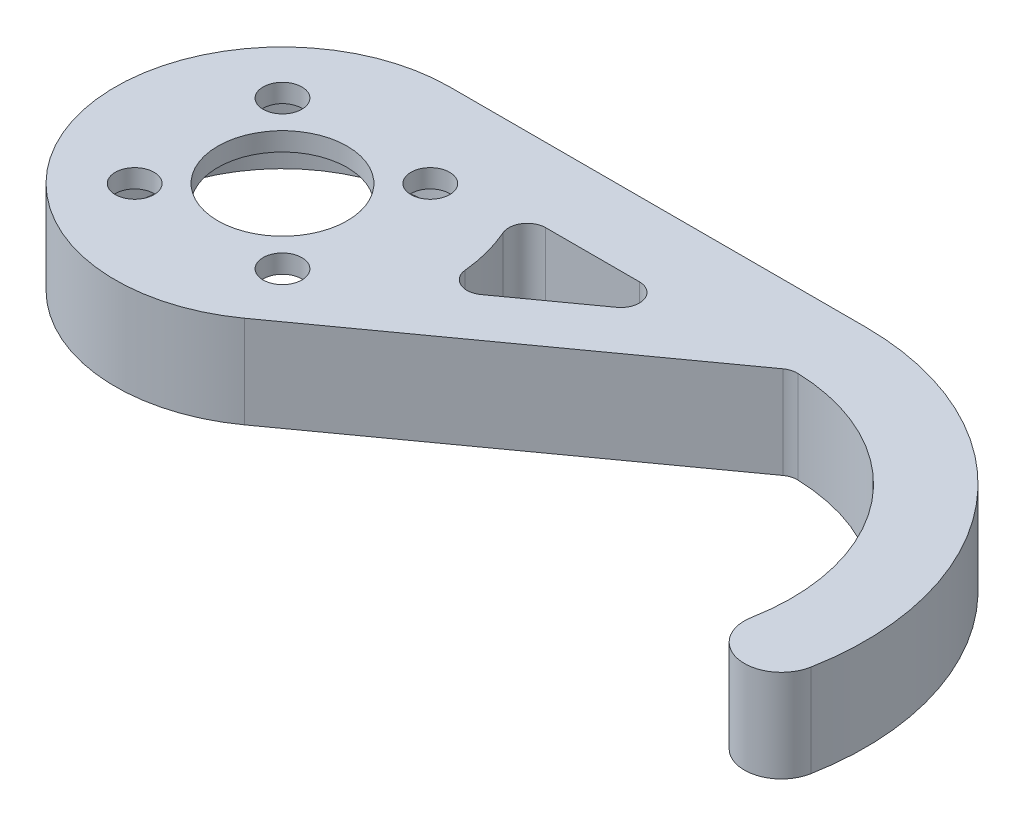
ISO-10303-21;
HEADER;
FILE_DESCRIPTION(('STEP AP214'),'2;1');
FILE_NAME('part.step','',(''),(''),'','','');
FILE_SCHEMA(('AUTOMOTIVE_DESIGN { 1 0 10303 214 1 1 1 1 }'));
ENDSEC;
DATA;
#1=APPLICATION_CONTEXT('core data for automotive mechanical design processes');
#2=APPLICATION_PROTOCOL_DEFINITION('international standard','automotive_design',2000,#1);
#3=PRODUCT_CONTEXT('',#1,'mechanical');
#4=PRODUCT('Part','Part','',(#3));
#5=PRODUCT_RELATED_PRODUCT_CATEGORY('part','',(#4));
#6=PRODUCT_DEFINITION_FORMATION('','',#4);
#7=PRODUCT_DEFINITION_CONTEXT('part definition',#1,'design');
#8=PRODUCT_DEFINITION('design','',#6,#7);
#9=PRODUCT_DEFINITION_SHAPE('','',#8);
#10=(LENGTH_UNIT() NAMED_UNIT(*) SI_UNIT(.MILLI.,.METRE.));
#11=(NAMED_UNIT(*) PLANE_ANGLE_UNIT() SI_UNIT($,.RADIAN.));
#12=(NAMED_UNIT(*) SI_UNIT($,.STERADIAN.) SOLID_ANGLE_UNIT());
#13=UNCERTAINTY_MEASURE_WITH_UNIT(LENGTH_MEASURE(1.E-05),#10,'distance_accuracy_value','');
#14=(GEOMETRIC_REPRESENTATION_CONTEXT(3) GLOBAL_UNCERTAINTY_ASSIGNED_CONTEXT((#13)) GLOBAL_UNIT_ASSIGNED_CONTEXT((#10,
#11,#12)) REPRESENTATION_CONTEXT('',''));
#15=CARTESIAN_POINT('',(0.,0.,0.));
#16=DIRECTION('',(0.,0.,1.));
#17=DIRECTION('',(1.,0.,0.));
#18=AXIS2_PLACEMENT_3D('',#15,#16,#17);
#19=CARTESIAN_POINT('',(-8.,10.,-8.));
#20=DIRECTION('',(0.,-1.,0.));
#21=DIRECTION('',(0.,0.,-1.));
#22=AXIS2_PLACEMENT_3D('',#19,#20,#21);
#23=CYLINDRICAL_SURFACE('',#22,2.1);
#24=CARTESIAN_POINT('',(-8.,10.,-8.));
#25=DIRECTION('',(0.,1.,0.));
#26=DIRECTION('',(0.,0.,1.));
#27=AXIS2_PLACEMENT_3D('',#24,#25,#26);
#28=CIRCLE('',#27,2.1);
#29=CARTESIAN_POINT('',(-8.,10.,-5.9));
#30=VERTEX_POINT('',#29);
#31=EDGE_CURVE('E248',#30,#30,#28,.T.);
#32=ORIENTED_EDGE('',*,*,#31,.T.);
#33=EDGE_LOOP('',(#32));
#34=FACE_BOUND('',#33,.T.);
#35=CARTESIAN_POINT('',(-8.,8.,-8.));
#36=DIRECTION('',(0.,-1.,0.));
#37=DIRECTION('',(0.,0.,-1.));
#38=AXIS2_PLACEMENT_3D('',#35,#36,#37);
#39=CIRCLE('',#38,2.1);
#40=CARTESIAN_POINT('',(-8.,8.,-10.1));
#41=VERTEX_POINT('',#40);
#42=EDGE_CURVE('E369',#41,#41,#39,.T.);
#43=ORIENTED_EDGE('',*,*,#42,.T.);
#44=EDGE_LOOP('',(#43));
#45=FACE_BOUND('',#44,.T.);
#46=ADVANCED_FACE('F41',(#34,#45),#23,.F.);
#47=CARTESIAN_POINT('',(8.,10.,-8.));
#48=DIRECTION('',(0.,-1.,0.));
#49=DIRECTION('',(0.,0.,-1.));
#50=AXIS2_PLACEMENT_3D('',#47,#48,#49);
#51=CYLINDRICAL_SURFACE('',#50,2.1);
#52=CARTESIAN_POINT('',(8.,10.,-8.));
#53=DIRECTION('',(0.,1.,0.));
#54=DIRECTION('',(0.,0.,1.));
#55=AXIS2_PLACEMENT_3D('',#52,#53,#54);
#56=CIRCLE('',#55,2.1);
#57=CARTESIAN_POINT('',(8.,10.,-5.9));
#58=VERTEX_POINT('',#57);
#59=EDGE_CURVE('E255',#58,#58,#56,.T.);
#60=ORIENTED_EDGE('',*,*,#59,.T.);
#61=EDGE_LOOP('',(#60));
#62=FACE_BOUND('',#61,.T.);
#63=CARTESIAN_POINT('',(8.,8.,-8.));
#64=DIRECTION('',(0.,-1.,0.));
#65=DIRECTION('',(0.,0.,-1.));
#66=AXIS2_PLACEMENT_3D('',#63,#64,#65);
#67=CIRCLE('',#66,2.1);
#68=CARTESIAN_POINT('',(8.,8.,-10.1));
#69=VERTEX_POINT('',#68);
#70=EDGE_CURVE('E365',#69,#69,#67,.T.);
#71=ORIENTED_EDGE('',*,*,#70,.T.);
#72=EDGE_LOOP('',(#71));
#73=FACE_BOUND('',#72,.T.);
#74=ADVANCED_FACE('F319',(#62,#73),#51,.F.);
#75=CARTESIAN_POINT('',(8.,10.,8.));
#76=DIRECTION('',(0.,-1.,0.));
#77=DIRECTION('',(0.,0.,-1.));
#78=AXIS2_PLACEMENT_3D('',#75,#76,#77);
#79=CYLINDRICAL_SURFACE('',#78,2.1);
#80=CARTESIAN_POINT('',(8.,10.,8.));
#81=DIRECTION('',(0.,1.,0.));
#82=DIRECTION('',(0.,0.,1.));
#83=AXIS2_PLACEMENT_3D('',#80,#81,#82);
#84=CIRCLE('',#83,2.1);
#85=CARTESIAN_POINT('',(8.,10.,10.1));
#86=VERTEX_POINT('',#85);
#87=EDGE_CURVE('E381',#86,#86,#84,.T.);
#88=ORIENTED_EDGE('',*,*,#87,.T.);
#89=EDGE_LOOP('',(#88));
#90=FACE_BOUND('',#89,.T.);
#91=CARTESIAN_POINT('',(8.,8.,8.));
#92=DIRECTION('',(0.,-1.,0.));
#93=DIRECTION('',(0.,0.,-1.));
#94=AXIS2_PLACEMENT_3D('',#91,#92,#93);
#95=CIRCLE('',#94,2.1);
#96=CARTESIAN_POINT('',(8.,8.,5.9));
#97=VERTEX_POINT('',#96);
#98=EDGE_CURVE('E361',#97,#97,#95,.T.);
#99=ORIENTED_EDGE('',*,*,#98,.T.);
#100=EDGE_LOOP('',(#99));
#101=FACE_BOUND('',#100,.T.);
#102=ADVANCED_FACE('F325',(#90,#101),#79,.F.);
#103=CARTESIAN_POINT('',(-8.,10.,8.));
#104=DIRECTION('',(0.,-1.,0.));
#105=DIRECTION('',(0.,0.,-1.));
#106=AXIS2_PLACEMENT_3D('',#103,#104,#105);
#107=CYLINDRICAL_SURFACE('',#106,2.1);
#108=CARTESIAN_POINT('',(-8.,10.,8.));
#109=DIRECTION('',(0.,1.,0.));
#110=DIRECTION('',(0.,0.,1.));
#111=AXIS2_PLACEMENT_3D('',#108,#109,#110);
#112=CIRCLE('',#111,2.1);
#113=CARTESIAN_POINT('',(-8.,10.,10.1));
#114=VERTEX_POINT('',#113);
#115=EDGE_CURVE('E377',#114,#114,#112,.T.);
#116=ORIENTED_EDGE('',*,*,#115,.T.);
#117=EDGE_LOOP('',(#116));
#118=FACE_BOUND('',#117,.T.);
#119=CARTESIAN_POINT('',(-8.,8.,8.));
#120=DIRECTION('',(0.,-1.,0.));
#121=DIRECTION('',(0.,0.,-1.));
#122=AXIS2_PLACEMENT_3D('',#119,#120,#121);
#123=CIRCLE('',#122,2.1);
#124=CARTESIAN_POINT('',(-8.,8.,5.9));
#125=VERTEX_POINT('',#124);
#126=EDGE_CURVE('E357',#125,#125,#123,.T.);
#127=ORIENTED_EDGE('',*,*,#126,.T.);
#128=EDGE_LOOP('',(#127));
#129=FACE_BOUND('',#128,.T.);
#130=ADVANCED_FACE('F497',(#118,#129),#107,.F.);
#131=CARTESIAN_POINT('',(0.,10.,0.));
#132=DIRECTION('',(0.,-1.,0.));
#133=DIRECTION('',(0.,0.,-1.));
#134=AXIS2_PLACEMENT_3D('',#131,#132,#133);
#135=CYLINDRICAL_SURFACE('',#134,7.);
#136=CARTESIAN_POINT('',(0.,10.,0.));
#137=DIRECTION('',(0.,1.,0.));
#138=DIRECTION('',(0.,0.,1.));
#139=AXIS2_PLACEMENT_3D('',#136,#137,#138);
#140=CIRCLE('',#139,7.);
#141=CARTESIAN_POINT('',(0.,10.,7.));
#142=VERTEX_POINT('',#141);
#143=EDGE_CURVE('E373',#142,#142,#140,.T.);
#144=ORIENTED_EDGE('',*,*,#143,.T.);
#145=EDGE_LOOP('',(#144));
#146=FACE_BOUND('',#145,.T.);
#147=CARTESIAN_POINT('',(0.,8.,0.));
#148=DIRECTION('',(0.,-1.,0.));
#149=DIRECTION('',(0.,0.,-1.));
#150=AXIS2_PLACEMENT_3D('',#147,#148,#149);
#151=CIRCLE('',#150,7.);
#152=CARTESIAN_POINT('',(0.,8.,-7.));
#153=VERTEX_POINT('',#152);
#154=EDGE_CURVE('E45',#153,#153,#151,.T.);
#155=ORIENTED_EDGE('',*,*,#154,.T.);
#156=EDGE_LOOP('',(#155));
#157=FACE_BOUND('',#156,.T.);
#158=ADVANCED_FACE('F338',(#146,#157),#135,.F.);
#159=CARTESIAN_POINT('',(0.,10.,0.));
#160=DIRECTION('',(0.,1.,0.));
#161=DIRECTION('',(0.,0.,1.));
#162=AXIS2_PLACEMENT_3D('',#159,#160,#161);
#163=PLANE('',#162);
#164=ORIENTED_EDGE('',*,*,#115,.F.);
#165=EDGE_LOOP('',(#164));
#166=FACE_BOUND('',#165,.T.);
#167=ORIENTED_EDGE('',*,*,#59,.F.);
#168=EDGE_LOOP('',(#167));
#169=FACE_BOUND('',#168,.T.);
#170=DIRECTION('',(0.811495989502268,0.,-0.584357988754953));
#171=VECTOR('',#170,1.);
#172=CARTESIAN_POINT('',(34.7323214271722,10.,-10.1));
#173=LINE('',#172,#171);
#174=CARTESIAN_POINT('',(21.1730284192665,10.,-0.335957671338935));
#175=VERTEX_POINT('',#174);
#176=CARTESIAN_POINT('',(29.7010845526234,10.,-6.47700802099547));
#177=VERTEX_POINT('',#176);
#178=EDGE_CURVE('E234',#175,#177,#173,.T.);
#179=ORIENTED_EDGE('',*,*,#178,.F.);
#180=CARTESIAN_POINT('',(20.0043124417566,10.,-1.95894965034347));
#181=DIRECTION('',(0.,1.,0.));
#182=DIRECTION('',(0.,0.,1.));
#183=AXIS2_PLACEMENT_3D('',#180,#181,#182);
#184=CIRCLE('',#183,2.);
#185=CARTESIAN_POINT('',(18.0138335918306,10.,-1.76402928712522));
#186=VERTEX_POINT('',#185);
#187=EDGE_CURVE('E199',#175,#186,#184,.F.);
#188=ORIENTED_EDGE('',*,*,#187,.T.);
#189=CARTESIAN_POINT('',(0.,10.,0.));
#190=DIRECTION('',(0.,-1.,0.));
#191=DIRECTION('',(0.,0.,1.));
#192=AXIS2_PLACEMENT_3D('',#189,#190,#191);
#193=CIRCLE('',#192,18.1);
#194=CARTESIAN_POINT('',(16.5652385595989,10.,-7.29402985074627));
#195=VERTEX_POINT('',#194);
#196=EDGE_CURVE('E224',#195,#186,#193,.T.);
#197=ORIENTED_EDGE('',*,*,#196,.F.);
#198=CARTESIAN_POINT('',(18.3956516601071,10.,-8.1));
#199=DIRECTION('',(0.,1.,0.));
#200=DIRECTION('',(0.,0.,1.));
#201=AXIS2_PLACEMENT_3D('',#198,#199,#200);
#202=CIRCLE('',#201,2.);
#203=CARTESIAN_POINT('',(18.3956516601071,10.,-10.1));
#204=VERTEX_POINT('',#203);
#205=EDGE_CURVE('E211',#195,#204,#202,.F.);
#206=ORIENTED_EDGE('',*,*,#205,.T.);
#207=DIRECTION('',(-1.,0.,0.));
#208=VECTOR('',#207,1.);
#209=CARTESIAN_POINT('',(15.0199866844149,10.,-10.1));
#210=LINE('',#209,#208);
#211=CARTESIAN_POINT('',(28.5323685751135,10.,-10.1));
#212=VERTEX_POINT('',#211);
#213=EDGE_CURVE('E221',#212,#204,#210,.T.);
#214=ORIENTED_EDGE('',*,*,#213,.F.);
#215=CARTESIAN_POINT('',(28.5323685751135,10.,-8.1));
#216=DIRECTION('',(0.,1.,0.));
#217=DIRECTION('',(0.,0.,1.));
#218=AXIS2_PLACEMENT_3D('',#215,#216,#217);
#219=CIRCLE('',#218,2.);
#220=EDGE_CURVE('E205',#212,#177,#219,.F.);
#221=ORIENTED_EDGE('',*,*,#220,.T.);
#222=EDGE_LOOP('',(#179,#188,#197,#206,#214,#221));
#223=FACE_BOUND('',#222,.T.);
#224=CARTESIAN_POINT('',(0.,10.,0.));
#225=DIRECTION('',(0.,1.,0.));
#226=DIRECTION('',(0.,0.,1.));
#227=AXIS2_PLACEMENT_3D('',#224,#225,#226);
#228=CIRCLE('',#227,18.1);
#229=CARTESIAN_POINT('',(0.,10.,-18.1));
#230=VERTEX_POINT('',#229);
#231=CARTESIAN_POINT('',(10.5768795964647,10.,14.6880774099911));
#232=VERTEX_POINT('',#231);
#233=EDGE_CURVE('E144',#230,#232,#228,.T.);
#234=ORIENTED_EDGE('',*,*,#233,.T.);
#235=DIRECTION('',(0.811495989502268,0.,-0.584357988754953));
#236=VECTOR('',#235,1.);
#237=CARTESIAN_POINT('',(45.,10.,-10.1));
#238=LINE('',#237,#236);
#239=CARTESIAN_POINT('',(44.4622221296821,10.,-9.71274633669029));
#240=VERTEX_POINT('',#239);
#241=EDGE_CURVE('E134',#232,#240,#238,.T.);
#242=ORIENTED_EDGE('',*,*,#241,.T.);
#243=CARTESIAN_POINT('',(45.630938107192,10.,-8.08975435768575));
#244=DIRECTION('',(0.,1.,0.));
#245=DIRECTION('',(0.,0.,1.));
#246=AXIS2_PLACEMENT_3D('',#243,#244,#245);
#247=CIRCLE('',#246,2.);
#248=CARTESIAN_POINT('',(45.6958759587285,10.,-10.0886998485478));
#249=VERTEX_POINT('',#248);
#250=EDGE_CURVE('E11',#240,#249,#247,.F.);
#251=ORIENTED_EDGE('',*,*,#250,.T.);
#252=CARTESIAN_POINT('',(45.,10.,11.3320598006645));
#253=DIRECTION('',(0.,-1.,0.));
#254=DIRECTION('',(0.,0.,-1.));
#255=AXIS2_PLACEMENT_3D('',#252,#253,#254);
#256=CIRCLE('',#255,21.4320598006645);
#257=CARTESIAN_POINT('',(66.0679551407241,10.,15.2658179894318));
#258=VERTEX_POINT('',#257);
#259=EDGE_CURVE('E143',#249,#258,#256,.T.);
#260=ORIENTED_EDGE('',*,*,#259,.T.);
#261=CARTESIAN_POINT('',(70.,10.,16.));
#262=DIRECTION('',(0.,1.,0.));
#263=DIRECTION('',(0.,0.,1.));
#264=AXIS2_PLACEMENT_3D('',#261,#262,#263);
#265=CIRCLE('',#264,4.);
#266=CARTESIAN_POINT('',(73.9320448592759,10.,16.7341820105682));
#267=VERTEX_POINT('',#266);
#268=EDGE_CURVE('E263',#258,#267,#265,.T.);
#269=ORIENTED_EDGE('',*,*,#268,.T.);
#270=CARTESIAN_POINT('',(45.,10.,11.3320598006645));
#271=DIRECTION('',(0.,1.,0.));
#272=DIRECTION('',(0.,0.,-1.));
#273=AXIS2_PLACEMENT_3D('',#270,#271,#272);
#274=CIRCLE('',#273,29.4320598006645);
#275=CARTESIAN_POINT('',(45.,10.,-18.1));
#276=VERTEX_POINT('',#275);
#277=EDGE_CURVE('E266',#267,#276,#274,.T.);
#278=ORIENTED_EDGE('',*,*,#277,.T.);
#279=DIRECTION('',(-1.,0.,0.));
#280=VECTOR('',#279,1.);
#281=CARTESIAN_POINT('',(0.,10.,-18.1));
#282=LINE('',#281,#280);
#283=EDGE_CURVE('E150',#276,#230,#282,.T.);
#284=ORIENTED_EDGE('',*,*,#283,.T.);
#285=EDGE_LOOP('',(#234,#242,#251,#260,#269,#278,#284));
#286=FACE_BOUND('',#285,.T.);
#287=ORIENTED_EDGE('',*,*,#31,.F.);
#288=EDGE_LOOP('',(#287));
#289=FACE_BOUND('',#288,.T.);
#290=ORIENTED_EDGE('',*,*,#87,.F.);
#291=EDGE_LOOP('',(#290));
#292=FACE_BOUND('',#291,.T.);
#293=ORIENTED_EDGE('',*,*,#143,.F.);
#294=EDGE_LOOP('',(#293));
#295=FACE_BOUND('',#294,.T.);
#296=ADVANCED_FACE('F147',(#166,#169,#223,#286,#289,#292,#295),#163,.T.);
#297=CARTESIAN_POINT('',(0.,0.,0.));
#298=DIRECTION('',(0.,1.,0.));
#299=DIRECTION('',(0.,0.,1.));
#300=AXIS2_PLACEMENT_3D('',#297,#298,#299);
#301=PLANE('',#300);
#302=CARTESIAN_POINT('',(0.,0.,0.));
#303=DIRECTION('',(0.,-1.,0.));
#304=DIRECTION('',(0.,0.,-1.));
#305=AXIS2_PLACEMENT_3D('',#302,#303,#304);
#306=CIRCLE('',#305,16.1);
#307=CARTESIAN_POINT('',(0.,0.,-16.1));
#308=VERTEX_POINT('',#307);
#309=EDGE_CURVE('E348',#308,#308,#306,.T.);
#310=ORIENTED_EDGE('',*,*,#309,.F.);
#311=EDGE_LOOP('',(#310));
#312=FACE_BOUND('',#311,.T.);
#313=CARTESIAN_POINT('',(0.,0.,0.));
#314=DIRECTION('',(0.,1.,0.));
#315=DIRECTION('',(0.,0.,1.));
#316=AXIS2_PLACEMENT_3D('',#313,#314,#315);
#317=CIRCLE('',#316,18.1);
#318=CARTESIAN_POINT('',(0.,0.,-18.1));
#319=VERTEX_POINT('',#318);
#320=CARTESIAN_POINT('',(10.5768795964647,0.,14.6880774099911));
#321=VERTEX_POINT('',#320);
#322=EDGE_CURVE('E159',#319,#321,#317,.T.);
#323=ORIENTED_EDGE('',*,*,#322,.F.);
#324=DIRECTION('',(-1.,0.,0.));
#325=VECTOR('',#324,1.);
#326=CARTESIAN_POINT('',(0.,0.,-18.1));
#327=LINE('',#326,#325);
#328=CARTESIAN_POINT('',(45.,0.,-18.1));
#329=VERTEX_POINT('',#328);
#330=EDGE_CURVE('E155',#329,#319,#327,.T.);
#331=ORIENTED_EDGE('',*,*,#330,.F.);
#332=CARTESIAN_POINT('',(45.,0.,11.3320598006645));
#333=DIRECTION('',(0.,1.,0.));
#334=DIRECTION('',(0.,0.,-1.));
#335=AXIS2_PLACEMENT_3D('',#332,#333,#334);
#336=CIRCLE('',#335,29.4320598006645);
#337=CARTESIAN_POINT('',(73.9320448592759,0.,16.7341820105682));
#338=VERTEX_POINT('',#337);
#339=EDGE_CURVE('E283',#338,#329,#336,.T.);
#340=ORIENTED_EDGE('',*,*,#339,.F.);
#341=CARTESIAN_POINT('',(70.,0.,16.));
#342=DIRECTION('',(0.,1.,0.));
#343=DIRECTION('',(0.,0.,1.));
#344=AXIS2_PLACEMENT_3D('',#341,#342,#343);
#345=CIRCLE('',#344,4.);
#346=CARTESIAN_POINT('',(66.0679551407241,0.,15.2658179894318));
#347=VERTEX_POINT('',#346);
#348=EDGE_CURVE('E280',#347,#338,#345,.T.);
#349=ORIENTED_EDGE('',*,*,#348,.F.);
#350=CARTESIAN_POINT('',(45.,0.,11.3320598006645));
#351=DIRECTION('',(0.,-1.,0.));
#352=DIRECTION('',(0.,0.,-1.));
#353=AXIS2_PLACEMENT_3D('',#350,#351,#352);
#354=CIRCLE('',#353,21.4320598006645);
#355=CARTESIAN_POINT('',(45.6958759587285,0.,-10.0886998485478));
#356=VERTEX_POINT('',#355);
#357=EDGE_CURVE('E277',#356,#347,#354,.T.);
#358=ORIENTED_EDGE('',*,*,#357,.F.);
#359=CARTESIAN_POINT('',(45.630938107192,0.,-8.08975435768575));
#360=DIRECTION('',(0.,1.,0.));
#361=DIRECTION('',(0.,0.,1.));
#362=AXIS2_PLACEMENT_3D('',#359,#360,#361);
#363=CIRCLE('',#362,2.);
#364=CARTESIAN_POINT('',(44.4622221296821,0.,-9.71274633669029));
#365=VERTEX_POINT('',#364);
#366=EDGE_CURVE('E51',#356,#365,#363,.T.);
#367=ORIENTED_EDGE('',*,*,#366,.T.);
#368=DIRECTION('',(0.811495989502268,0.,-0.584357988754953));
#369=VECTOR('',#368,1.);
#370=CARTESIAN_POINT('',(45.,0.,-10.1));
#371=LINE('',#370,#369);
#372=EDGE_CURVE('E274',#321,#365,#371,.T.);
#373=ORIENTED_EDGE('',*,*,#372,.F.);
#374=EDGE_LOOP('',(#323,#331,#340,#349,#358,#367,#373));
#375=FACE_BOUND('',#374,.T.);
#376=DIRECTION('',(-1.,0.,0.));
#377=VECTOR('',#376,1.);
#378=CARTESIAN_POINT('',(15.0199866844149,0.,-10.1));
#379=LINE('',#378,#377);
#380=CARTESIAN_POINT('',(28.5323685751135,0.,-10.1));
#381=VERTEX_POINT('',#380);
#382=CARTESIAN_POINT('',(18.3956516601071,0.,-10.1));
#383=VERTEX_POINT('',#382);
#384=EDGE_CURVE('E242',#381,#383,#379,.T.);
#385=ORIENTED_EDGE('',*,*,#384,.T.);
#386=CARTESIAN_POINT('',(18.3956516601071,0.,-8.1));
#387=DIRECTION('',(0.,1.,0.));
#388=DIRECTION('',(0.,0.,1.));
#389=AXIS2_PLACEMENT_3D('',#386,#387,#388);
#390=CIRCLE('',#389,2.);
#391=CARTESIAN_POINT('',(16.5652385595989,0.,-7.29402985074627));
#392=VERTEX_POINT('',#391);
#393=EDGE_CURVE('E208',#383,#392,#390,.T.);
#394=ORIENTED_EDGE('',*,*,#393,.T.);
#395=CARTESIAN_POINT('',(0.,0.,0.));
#396=DIRECTION('',(0.,-1.,0.));
#397=DIRECTION('',(0.,0.,1.));
#398=AXIS2_PLACEMENT_3D('',#395,#396,#397);
#399=CIRCLE('',#398,18.1);
#400=CARTESIAN_POINT('',(18.0138335918306,0.,-1.76402928712522));
#401=VERTEX_POINT('',#400);
#402=EDGE_CURVE('E241',#392,#401,#399,.T.);
#403=ORIENTED_EDGE('',*,*,#402,.T.);
#404=CARTESIAN_POINT('',(20.0043124417566,0.,-1.95894965034347));
#405=DIRECTION('',(0.,1.,0.));
#406=DIRECTION('',(0.,0.,1.));
#407=AXIS2_PLACEMENT_3D('',#404,#405,#406);
#408=CIRCLE('',#407,2.);
#409=CARTESIAN_POINT('',(21.1730284192665,0.,-0.335957671338935));
#410=VERTEX_POINT('',#409);
#411=EDGE_CURVE('E196',#401,#410,#408,.T.);
#412=ORIENTED_EDGE('',*,*,#411,.T.);
#413=DIRECTION('',(0.811495989502268,0.,-0.584357988754953));
#414=VECTOR('',#413,1.);
#415=CARTESIAN_POINT('',(34.7323214271722,0.,-10.1));
#416=LINE('',#415,#414);
#417=CARTESIAN_POINT('',(29.7010845526234,0.,-6.47700802099547));
#418=VERTEX_POINT('',#417);
#419=EDGE_CURVE('E247',#410,#418,#416,.T.);
#420=ORIENTED_EDGE('',*,*,#419,.T.);
#421=CARTESIAN_POINT('',(28.5323685751135,0.,-8.1));
#422=DIRECTION('',(0.,1.,0.));
#423=DIRECTION('',(0.,0.,1.));
#424=AXIS2_PLACEMENT_3D('',#421,#422,#423);
#425=CIRCLE('',#424,2.);
#426=EDGE_CURVE('E202',#418,#381,#425,.T.);
#427=ORIENTED_EDGE('',*,*,#426,.T.);
#428=EDGE_LOOP('',(#385,#394,#403,#412,#420,#427));
#429=FACE_BOUND('',#428,.T.);
#430=ADVANCED_FACE('F240',(#312,#375,#429),#301,.F.);
#431=CARTESIAN_POINT('',(0.,10.,0.));
#432=DIRECTION('',(0.,-1.,0.));
#433=DIRECTION('',(0.,0.,-1.));
#434=AXIS2_PLACEMENT_3D('',#431,#432,#433);
#435=CYLINDRICAL_SURFACE('',#434,18.1);
#436=ORIENTED_EDGE('',*,*,#322,.T.);
#437=DIRECTION('',(0.,-1.,0.));
#438=VECTOR('',#437,1.);
#439=CARTESIAN_POINT('',(10.5768795964647,10.,14.6880774099911));
#440=LINE('',#439,#438);
#441=EDGE_CURVE('E138',#232,#321,#440,.T.);
#442=ORIENTED_EDGE('',*,*,#441,.F.);
#443=ORIENTED_EDGE('',*,*,#233,.F.);
#444=DIRECTION('',(0.,-1.,0.));
#445=VECTOR('',#444,1.);
#446=CARTESIAN_POINT('',(0.,10.,-18.1));
#447=LINE('',#446,#445);
#448=EDGE_CURVE('E271',#230,#319,#447,.T.);
#449=ORIENTED_EDGE('',*,*,#448,.T.);
#450=EDGE_LOOP('',(#436,#442,#443,#449));
#451=FACE_BOUND('',#450,.T.);
#452=ADVANCED_FACE('F157',(#451),#435,.T.);
#453=CARTESIAN_POINT('',(45.,10.,-10.1));
#454=DIRECTION('',(-0.584357988754953,0.,-0.811495989502268));
#455=DIRECTION('',(-0.811495989502268,0.,0.584357988754954));
#456=AXIS2_PLACEMENT_3D('',#453,#454,#455);
#457=PLANE('',#456);
#458=ORIENTED_EDGE('',*,*,#372,.T.);
#459=DIRECTION('',(0.,1.,0.));
#460=VECTOR('',#459,1.);
#461=CARTESIAN_POINT('',(44.4622221296821,10.,-9.71274633669029));
#462=LINE('',#461,#460);
#463=EDGE_CURVE('E58',#365,#240,#462,.T.);
#464=ORIENTED_EDGE('',*,*,#463,.T.);
#465=ORIENTED_EDGE('',*,*,#241,.F.);
#466=ORIENTED_EDGE('',*,*,#441,.T.);
#467=EDGE_LOOP('',(#458,#464,#465,#466));
#468=FACE_BOUND('',#467,.T.);
#469=ADVANCED_FACE('F136',(#468),#457,.F.);
#470=CARTESIAN_POINT('',(45.,10.,11.3320598006645));
#471=DIRECTION('',(0.,-1.,0.));
#472=DIRECTION('',(0.,0.,-1.));
#473=AXIS2_PLACEMENT_3D('',#470,#471,#472);
#474=CYLINDRICAL_SURFACE('',#473,21.4320598006645);
#475=ORIENTED_EDGE('',*,*,#259,.F.);
#476=DIRECTION('',(0.,-1.,0.));
#477=VECTOR('',#476,1.);
#478=CARTESIAN_POINT('',(45.6958759587285,10.,-10.0886998485478));
#479=LINE('',#478,#477);
#480=EDGE_CURVE('E190',#249,#356,#479,.T.);
#481=ORIENTED_EDGE('',*,*,#480,.T.);
#482=ORIENTED_EDGE('',*,*,#357,.T.);
#483=DIRECTION('',(0.,-1.,0.));
#484=VECTOR('',#483,1.);
#485=CARTESIAN_POINT('',(66.0679551407241,10.,15.2658179894318));
#486=LINE('',#485,#484);
#487=EDGE_CURVE('E162',#258,#347,#486,.T.);
#488=ORIENTED_EDGE('',*,*,#487,.F.);
#489=EDGE_LOOP('',(#475,#481,#482,#488));
#490=FACE_BOUND('',#489,.T.);
#491=ADVANCED_FACE('F421',(#490),#474,.F.);
#492=CARTESIAN_POINT('',(70.,10.,16.));
#493=DIRECTION('',(0.,-1.,0.));
#494=DIRECTION('',(0.,0.,-1.));
#495=AXIS2_PLACEMENT_3D('',#492,#493,#494);
#496=CYLINDRICAL_SURFACE('',#495,4.);
#497=ORIENTED_EDGE('',*,*,#348,.T.);
#498=DIRECTION('',(0.,-1.,0.));
#499=VECTOR('',#498,1.);
#500=CARTESIAN_POINT('',(73.9320448592759,10.,16.7341820105682));
#501=LINE('',#500,#499);
#502=EDGE_CURVE('E169',#267,#338,#501,.T.);
#503=ORIENTED_EDGE('',*,*,#502,.F.);
#504=ORIENTED_EDGE('',*,*,#268,.F.);
#505=ORIENTED_EDGE('',*,*,#487,.T.);
#506=EDGE_LOOP('',(#497,#503,#504,#505));
#507=FACE_BOUND('',#506,.T.);
#508=ADVANCED_FACE('F315',(#507),#496,.T.);
#509=CARTESIAN_POINT('',(45.,10.,11.3320598006645));
#510=DIRECTION('',(0.,-1.,0.));
#511=DIRECTION('',(0.,0.,-1.));
#512=AXIS2_PLACEMENT_3D('',#509,#510,#511);
#513=CYLINDRICAL_SURFACE('',#512,29.4320598006645);
#514=ORIENTED_EDGE('',*,*,#339,.T.);
#515=DIRECTION('',(0.,-1.,0.));
#516=VECTOR('',#515,1.);
#517=CARTESIAN_POINT('',(45.,10.,-18.1));
#518=LINE('',#517,#516);
#519=EDGE_CURVE('E290',#276,#329,#518,.T.);
#520=ORIENTED_EDGE('',*,*,#519,.F.);
#521=ORIENTED_EDGE('',*,*,#277,.F.);
#522=ORIENTED_EDGE('',*,*,#502,.T.);
#523=EDGE_LOOP('',(#514,#520,#521,#522));
#524=FACE_BOUND('',#523,.T.);
#525=ADVANCED_FACE('F299',(#524),#513,.T.);
#526=CARTESIAN_POINT('',(0.,10.,-18.1));
#527=DIRECTION('',(0.,0.,1.));
#528=DIRECTION('',(1.,0.,0.));
#529=AXIS2_PLACEMENT_3D('',#526,#527,#528);
#530=PLANE('',#529);
#531=ORIENTED_EDGE('',*,*,#330,.T.);
#532=ORIENTED_EDGE('',*,*,#448,.F.);
#533=ORIENTED_EDGE('',*,*,#283,.F.);
#534=ORIENTED_EDGE('',*,*,#519,.T.);
#535=EDGE_LOOP('',(#531,#532,#533,#534));
#536=FACE_BOUND('',#535,.T.);
#537=ADVANCED_FACE('F306',(#536),#530,.F.);
#538=CARTESIAN_POINT('',(0.,10.,0.));
#539=DIRECTION('',(0.,-1.,0.));
#540=DIRECTION('',(0.,0.,-1.));
#541=AXIS2_PLACEMENT_3D('',#538,#539,#540);
#542=CYLINDRICAL_SURFACE('',#541,18.1);
#543=ORIENTED_EDGE('',*,*,#196,.T.);
#544=DIRECTION('',(0.,-1.,0.));
#545=VECTOR('',#544,1.);
#546=CARTESIAN_POINT('',(18.0138335918306,10.,-1.76402928712522));
#547=LINE('',#546,#545);
#548=EDGE_CURVE('E166',#186,#401,#547,.T.);
#549=ORIENTED_EDGE('',*,*,#548,.T.);
#550=ORIENTED_EDGE('',*,*,#402,.F.);
#551=DIRECTION('',(0.,-1.,0.));
#552=VECTOR('',#551,1.);
#553=CARTESIAN_POINT('',(16.5652385595989,10.,-7.29402985074627));
#554=LINE('',#553,#552);
#555=EDGE_CURVE('E161',#392,#195,#554,.F.);
#556=ORIENTED_EDGE('',*,*,#555,.T.);
#557=EDGE_LOOP('',(#543,#549,#550,#556));
#558=FACE_BOUND('',#557,.T.);
#559=ADVANCED_FACE('F244',(#558),#542,.T.);
#560=CARTESIAN_POINT('',(34.7323214271722,10.,-10.1));
#561=DIRECTION('',(-0.584357988754953,0.,-0.811495989502268));
#562=DIRECTION('',(-0.811495989502268,0.,0.584357988754954));
#563=AXIS2_PLACEMENT_3D('',#560,#561,#562);
#564=PLANE('',#563);
#565=ORIENTED_EDGE('',*,*,#419,.F.);
#566=DIRECTION('',(0.,1.,0.));
#567=VECTOR('',#566,1.);
#568=CARTESIAN_POINT('',(21.1730284192665,10.,-0.335957671338934));
#569=LINE('',#568,#567);
#570=EDGE_CURVE('E180',#410,#175,#569,.T.);
#571=ORIENTED_EDGE('',*,*,#570,.T.);
#572=ORIENTED_EDGE('',*,*,#178,.T.);
#573=DIRECTION('',(0.,-1.,0.));
#574=VECTOR('',#573,1.);
#575=CARTESIAN_POINT('',(29.7010845526234,0.,-6.47700802099547));
#576=LINE('',#575,#574);
#577=EDGE_CURVE('E176',#177,#418,#576,.T.);
#578=ORIENTED_EDGE('',*,*,#577,.T.);
#579=EDGE_LOOP('',(#565,#571,#572,#578));
#580=FACE_BOUND('',#579,.T.);
#581=ADVANCED_FACE('F313',(#580),#564,.T.);
#582=CARTESIAN_POINT('',(15.0199866844149,10.,-10.1));
#583=DIRECTION('',(0.,0.,1.));
#584=DIRECTION('',(1.,0.,0.));
#585=AXIS2_PLACEMENT_3D('',#582,#583,#584);
#586=PLANE('',#585);
#587=ORIENTED_EDGE('',*,*,#384,.F.);
#588=DIRECTION('',(0.,-1.,0.));
#589=VECTOR('',#588,1.);
#590=CARTESIAN_POINT('',(28.5323685751135,10.,-10.1));
#591=LINE('',#590,#589);
#592=EDGE_CURVE('E187',#381,#212,#591,.F.);
#593=ORIENTED_EDGE('',*,*,#592,.T.);
#594=ORIENTED_EDGE('',*,*,#213,.T.);
#595=DIRECTION('',(0.,1.,0.));
#596=VECTOR('',#595,1.);
#597=CARTESIAN_POINT('',(18.3956516601071,0.,-10.1));
#598=LINE('',#597,#596);
#599=EDGE_CURVE('E183',#204,#383,#598,.F.);
#600=ORIENTED_EDGE('',*,*,#599,.T.);
#601=EDGE_LOOP('',(#587,#593,#594,#600));
#602=FACE_BOUND('',#601,.T.);
#603=ADVANCED_FACE('F230',(#602),#586,.T.);
#604=CARTESIAN_POINT('',(20.0043124417566,10.,-1.95894965034347));
#605=DIRECTION('',(0.,-1.,0.));
#606=DIRECTION('',(0.,0.,-1.));
#607=AXIS2_PLACEMENT_3D('',#604,#605,#606);
#608=CYLINDRICAL_SURFACE('',#607,2.);
#609=ORIENTED_EDGE('',*,*,#187,.F.);
#610=ORIENTED_EDGE('',*,*,#570,.F.);
#611=ORIENTED_EDGE('',*,*,#411,.F.);
#612=ORIENTED_EDGE('',*,*,#548,.F.);
#613=EDGE_LOOP('',(#609,#610,#611,#612));
#614=FACE_BOUND('',#613,.T.);
#615=ADVANCED_FACE('F333',(#614),#608,.F.);
#616=CARTESIAN_POINT('',(28.5323685751135,10.,-8.1));
#617=DIRECTION('',(0.,1.,0.));
#618=DIRECTION('',(0.,0.,1.));
#619=AXIS2_PLACEMENT_3D('',#616,#617,#618);
#620=CYLINDRICAL_SURFACE('',#619,2.);
#621=ORIENTED_EDGE('',*,*,#220,.F.);
#622=ORIENTED_EDGE('',*,*,#592,.F.);
#623=ORIENTED_EDGE('',*,*,#426,.F.);
#624=ORIENTED_EDGE('',*,*,#577,.F.);
#625=EDGE_LOOP('',(#621,#622,#623,#624));
#626=FACE_BOUND('',#625,.T.);
#627=ADVANCED_FACE('F396',(#626),#620,.F.);
#628=CARTESIAN_POINT('',(18.3956516601071,10.,-8.1));
#629=DIRECTION('',(0.,-1.,0.));
#630=DIRECTION('',(0.,0.,-1.));
#631=AXIS2_PLACEMENT_3D('',#628,#629,#630);
#632=CYLINDRICAL_SURFACE('',#631,2.);
#633=ORIENTED_EDGE('',*,*,#205,.F.);
#634=ORIENTED_EDGE('',*,*,#555,.F.);
#635=ORIENTED_EDGE('',*,*,#393,.F.);
#636=ORIENTED_EDGE('',*,*,#599,.F.);
#637=EDGE_LOOP('',(#633,#634,#635,#636));
#638=FACE_BOUND('',#637,.T.);
#639=ADVANCED_FACE('F236',(#638),#632,.F.);
#640=CARTESIAN_POINT('',(45.630938107192,10.,-8.08975435768575));
#641=DIRECTION('',(0.,-1.,0.));
#642=DIRECTION('',(0.,0.,-1.));
#643=AXIS2_PLACEMENT_3D('',#640,#641,#642);
#644=CYLINDRICAL_SURFACE('',#643,2.);
#645=ORIENTED_EDGE('',*,*,#250,.F.);
#646=ORIENTED_EDGE('',*,*,#463,.F.);
#647=ORIENTED_EDGE('',*,*,#366,.F.);
#648=ORIENTED_EDGE('',*,*,#480,.F.);
#649=EDGE_LOOP('',(#645,#646,#647,#648));
#650=FACE_BOUND('',#649,.T.);
#651=ADVANCED_FACE('F43',(#650),#644,.F.);
#652=CARTESIAN_POINT('',(0.,8.,0.));
#653=DIRECTION('',(0.,-1.,0.));
#654=DIRECTION('',(0.,0.,-1.));
#655=AXIS2_PLACEMENT_3D('',#652,#653,#654);
#656=CYLINDRICAL_SURFACE('',#655,16.1);
#657=CARTESIAN_POINT('',(0.,8.,0.));
#658=DIRECTION('',(0.,-1.,0.));
#659=DIRECTION('',(0.,0.,-1.));
#660=AXIS2_PLACEMENT_3D('',#657,#658,#659);
#661=CIRCLE('',#660,16.1);
#662=CARTESIAN_POINT('',(0.,8.,-16.1));
#663=VERTEX_POINT('',#662);
#664=EDGE_CURVE('E351',#663,#663,#661,.T.);
#665=ORIENTED_EDGE('',*,*,#664,.F.);
#666=EDGE_LOOP('',(#665));
#667=FACE_BOUND('',#666,.T.);
#668=ORIENTED_EDGE('',*,*,#309,.T.);
#669=EDGE_LOOP('',(#668));
#670=FACE_BOUND('',#669,.T.);
#671=ADVANCED_FACE('F409',(#667,#670),#656,.F.);
#672=CARTESIAN_POINT('',(0.,8.,0.));
#673=DIRECTION('',(0.,-1.,0.));
#674=DIRECTION('',(0.,0.,-1.));
#675=AXIS2_PLACEMENT_3D('',#672,#673,#674);
#676=PLANE('',#675);
#677=ORIENTED_EDGE('',*,*,#42,.F.);
#678=EDGE_LOOP('',(#677));
#679=FACE_BOUND('',#678,.T.);
#680=ORIENTED_EDGE('',*,*,#70,.F.);
#681=EDGE_LOOP('',(#680));
#682=FACE_BOUND('',#681,.T.);
#683=ORIENTED_EDGE('',*,*,#98,.F.);
#684=EDGE_LOOP('',(#683));
#685=FACE_BOUND('',#684,.T.);
#686=ORIENTED_EDGE('',*,*,#126,.F.);
#687=EDGE_LOOP('',(#686));
#688=FACE_BOUND('',#687,.T.);
#689=ORIENTED_EDGE('',*,*,#154,.F.);
#690=EDGE_LOOP('',(#689));
#691=FACE_BOUND('',#690,.T.);
#692=ORIENTED_EDGE('',*,*,#664,.T.);
#693=EDGE_LOOP('',(#692));
#694=FACE_BOUND('',#693,.T.);
#695=ADVANCED_FACE('F414',(#679,#682,#685,#688,#691,#694),#676,.T.);
#696=CLOSED_SHELL('',(#46,#74,#102,#130,#158,#296,#430,#452,#469,#491,#508,#525,#537,#559,#581,
#603,#615,#627,#639,#651,#671,#695));
#697=MANIFOLD_SOLID_BREP('B2',#696);
#698=ADVANCED_BREP_SHAPE_REPRESENTATION('',(#18,#697),#14);
#699=SHAPE_DEFINITION_REPRESENTATION(#9,#698);
ENDSEC;
END-ISO-10303-21;
